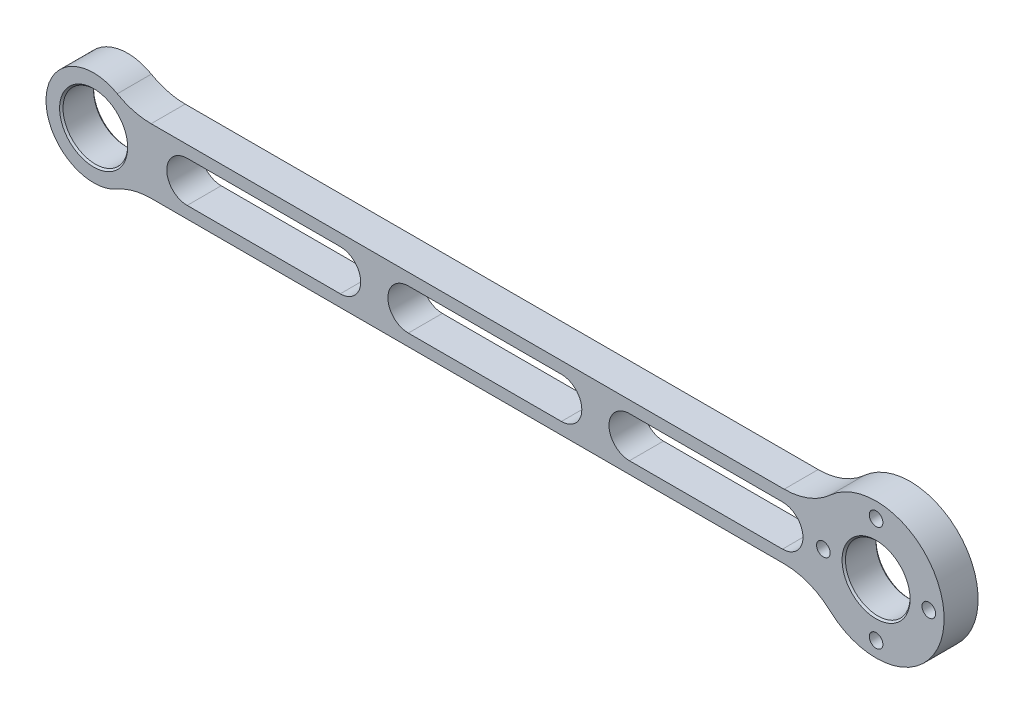
ISO-10303-21;
HEADER;
FILE_DESCRIPTION(('STEP AP214'),'2;1');
FILE_NAME('part.step','',(''),(''),'','','');
FILE_SCHEMA(('AUTOMOTIVE_DESIGN { 1 0 10303 214 1 1 1 1 }'));
ENDSEC;
DATA;
#1=APPLICATION_CONTEXT('core data for automotive mechanical design processes');
#2=APPLICATION_PROTOCOL_DEFINITION('international standard','automotive_design',2000,#1);
#3=PRODUCT_CONTEXT('',#1,'mechanical');
#4=PRODUCT('Part','Part','',(#3));
#5=PRODUCT_RELATED_PRODUCT_CATEGORY('part','',(#4));
#6=PRODUCT_DEFINITION_FORMATION('','',#4);
#7=PRODUCT_DEFINITION_CONTEXT('part definition',#1,'design');
#8=PRODUCT_DEFINITION('design','',#6,#7);
#9=PRODUCT_DEFINITION_SHAPE('','',#8);
#10=(LENGTH_UNIT() NAMED_UNIT(*) SI_UNIT(.MILLI.,.METRE.));
#11=(NAMED_UNIT(*) PLANE_ANGLE_UNIT() SI_UNIT($,.RADIAN.));
#12=(NAMED_UNIT(*) SI_UNIT($,.STERADIAN.) SOLID_ANGLE_UNIT());
#13=UNCERTAINTY_MEASURE_WITH_UNIT(LENGTH_MEASURE(1.E-05),#10,'distance_accuracy_value','');
#14=(GEOMETRIC_REPRESENTATION_CONTEXT(3) GLOBAL_UNCERTAINTY_ASSIGNED_CONTEXT((#13)) GLOBAL_UNIT_ASSIGNED_CONTEXT((#10,
#11,#12)) REPRESENTATION_CONTEXT('',''));
#15=CARTESIAN_POINT('',(0.,0.,0.));
#16=DIRECTION('',(0.,0.,1.));
#17=DIRECTION('',(1.,0.,0.));
#18=AXIS2_PLACEMENT_3D('',#15,#16,#17);
#19=CARTESIAN_POINT('',(202.986114681519,-29.5,10.));
#20=DIRECTION('',(0.,0.,-1.));
#21=DIRECTION('',(-1.,0.,0.));
#22=AXIS2_PLACEMENT_3D('',#19,#20,#21);
#23=CYLINDRICAL_SURFACE('',#22,20.);
#24=CARTESIAN_POINT('',(202.986114681519,-29.5,0.));
#25=DIRECTION('',(0.,0.,1.));
#26=DIRECTION('',(1.,0.,0.));
#27=AXIS2_PLACEMENT_3D('',#24,#25,#26);
#28=CIRCLE('',#27,20.);
#29=CARTESIAN_POINT('',(202.986114681519,-9.49999999999998,0.));
#30=VERTEX_POINT('',#29);
#31=CARTESIAN_POINT('',(216.49305734076,-14.7500000000001,0.));
#32=VERTEX_POINT('',#31);
#33=EDGE_CURVE('E276',#30,#32,#28,.F.);
#34=ORIENTED_EDGE('',*,*,#33,.T.);
#35=DIRECTION('',(0.,0.,-1.));
#36=VECTOR('',#35,1.);
#37=CARTESIAN_POINT('',(216.49305734076,-14.7500000000001,10.));
#38=LINE('',#37,#36);
#39=CARTESIAN_POINT('',(216.49305734076,-14.7500000000001,10.));
#40=VERTEX_POINT('',#39);
#41=EDGE_CURVE('E339',#40,#32,#38,.T.);
#42=ORIENTED_EDGE('',*,*,#41,.F.);
#43=CARTESIAN_POINT('',(202.986114681519,-29.5,10.));
#44=DIRECTION('',(0.,0.,1.));
#45=DIRECTION('',(1.,0.,0.));
#46=AXIS2_PLACEMENT_3D('',#43,#44,#45);
#47=CIRCLE('',#46,20.);
#48=CARTESIAN_POINT('',(202.986114681519,-9.49999999999998,10.));
#49=VERTEX_POINT('',#48);
#50=EDGE_CURVE('E283',#49,#40,#47,.F.);
#51=ORIENTED_EDGE('',*,*,#50,.F.);
#52=DIRECTION('',(0.,0.,-1.));
#53=VECTOR('',#52,1.);
#54=CARTESIAN_POINT('',(202.986114681519,-9.49999999999998,10.));
#55=LINE('',#54,#53);
#56=EDGE_CURVE('E303',#49,#30,#55,.T.);
#57=ORIENTED_EDGE('',*,*,#56,.T.);
#58=EDGE_LOOP('',(#34,#42,#51,#57));
#59=FACE_BOUND('',#58,.T.);
#60=ADVANCED_FACE('F40',(#59),#23,.F.);
#61=CARTESIAN_POINT('',(230.,0.,10.));
#62=DIRECTION('',(0.,0.,-1.));
#63=DIRECTION('',(-1.,0.,0.));
#64=AXIS2_PLACEMENT_3D('',#61,#62,#63);
#65=CYLINDRICAL_SURFACE('',#64,20.0000000000002);
#66=CARTESIAN_POINT('',(230.,0.,0.));
#67=DIRECTION('',(0.,0.,1.));
#68=DIRECTION('',(1.,0.,0.));
#69=AXIS2_PLACEMENT_3D('',#66,#67,#68);
#70=CIRCLE('',#69,20.0000000000002);
#71=CARTESIAN_POINT('',(216.49305734076,14.7500000000001,0.));
#72=VERTEX_POINT('',#71);
#73=EDGE_CURVE('E306',#32,#72,#70,.T.);
#74=ORIENTED_EDGE('',*,*,#73,.T.);
#75=DIRECTION('',(0.,0.,-1.));
#76=VECTOR('',#75,1.);
#77=CARTESIAN_POINT('',(216.49305734076,14.7500000000001,10.));
#78=LINE('',#77,#76);
#79=CARTESIAN_POINT('',(216.49305734076,14.7500000000001,10.));
#80=VERTEX_POINT('',#79);
#81=EDGE_CURVE('E336',#80,#72,#78,.T.);
#82=ORIENTED_EDGE('',*,*,#81,.F.);
#83=CARTESIAN_POINT('',(230.,0.,10.));
#84=DIRECTION('',(0.,0.,1.));
#85=DIRECTION('',(1.,0.,0.));
#86=AXIS2_PLACEMENT_3D('',#83,#84,#85);
#87=CIRCLE('',#86,20.0000000000002);
#88=EDGE_CURVE('E286',#40,#80,#87,.T.);
#89=ORIENTED_EDGE('',*,*,#88,.F.);
#90=ORIENTED_EDGE('',*,*,#41,.T.);
#91=EDGE_LOOP('',(#74,#82,#89,#90));
#92=FACE_BOUND('',#91,.T.);
#93=ADVANCED_FACE('F379',(#92),#65,.T.);
#94=CARTESIAN_POINT('',(202.98611468152,29.5,10.));
#95=DIRECTION('',(0.,0.,-1.));
#96=DIRECTION('',(-1.,0.,0.));
#97=AXIS2_PLACEMENT_3D('',#94,#95,#96);
#98=CYLINDRICAL_SURFACE('',#97,20.);
#99=CARTESIAN_POINT('',(202.98611468152,29.5,0.));
#100=DIRECTION('',(0.,0.,1.));
#101=DIRECTION('',(1.,0.,0.));
#102=AXIS2_PLACEMENT_3D('',#99,#100,#101);
#103=CIRCLE('',#102,20.);
#104=CARTESIAN_POINT('',(202.98611468152,9.50000000000002,0.));
#105=VERTEX_POINT('',#104);
#106=EDGE_CURVE('E308',#72,#105,#103,.F.);
#107=ORIENTED_EDGE('',*,*,#106,.T.);
#108=DIRECTION('',(0.,0.,-1.));
#109=VECTOR('',#108,1.);
#110=CARTESIAN_POINT('',(202.98611468152,9.50000000000002,10.));
#111=LINE('',#110,#109);
#112=CARTESIAN_POINT('',(202.98611468152,9.50000000000002,10.));
#113=VERTEX_POINT('',#112);
#114=EDGE_CURVE('E333',#113,#105,#111,.T.);
#115=ORIENTED_EDGE('',*,*,#114,.F.);
#116=CARTESIAN_POINT('',(202.98611468152,29.5,10.));
#117=DIRECTION('',(0.,0.,1.));
#118=DIRECTION('',(1.,0.,0.));
#119=AXIS2_PLACEMENT_3D('',#116,#117,#118);
#120=CIRCLE('',#119,20.);
#121=EDGE_CURVE('E289',#80,#113,#120,.F.);
#122=ORIENTED_EDGE('',*,*,#121,.F.);
#123=ORIENTED_EDGE('',*,*,#81,.T.);
#124=EDGE_LOOP('',(#107,#115,#122,#123));
#125=FACE_BOUND('',#124,.T.);
#126=ADVANCED_FACE('F385',(#125),#98,.F.);
#127=CARTESIAN_POINT('',(0.,9.49999999999999,10.));
#128=DIRECTION('',(0.,-1.,0.));
#129=DIRECTION('',(1.,0.,0.));
#130=AXIS2_PLACEMENT_3D('',#127,#128,#129);
#131=PLANE('',#130);
#132=DIRECTION('',(-1.,0.,0.));
#133=VECTOR('',#132,1.);
#134=CARTESIAN_POINT('',(0.,9.49999999999999,0.));
#135=LINE('',#134,#133);
#136=CARTESIAN_POINT('',(16.904141504377,9.49999999999999,0.));
#137=VERTEX_POINT('',#136);
#138=EDGE_CURVE('E310',#105,#137,#135,.T.);
#139=ORIENTED_EDGE('',*,*,#138,.T.);
#140=DIRECTION('',(0.,0.,-1.));
#141=VECTOR('',#140,1.);
#142=CARTESIAN_POINT('',(16.904141504377,9.49999999999999,10.));
#143=LINE('',#142,#141);
#144=CARTESIAN_POINT('',(16.904141504377,9.49999999999999,10.));
#145=VERTEX_POINT('',#144);
#146=EDGE_CURVE('E331',#145,#137,#143,.T.);
#147=ORIENTED_EDGE('',*,*,#146,.F.);
#148=DIRECTION('',(-1.,0.,0.));
#149=VECTOR('',#148,1.);
#150=CARTESIAN_POINT('',(0.,9.49999999999999,10.));
#151=LINE('',#150,#149);
#152=EDGE_CURVE('E291',#113,#145,#151,.T.);
#153=ORIENTED_EDGE('',*,*,#152,.F.);
#154=ORIENTED_EDGE('',*,*,#114,.T.);
#155=EDGE_LOOP('',(#139,#147,#153,#154));
#156=FACE_BOUND('',#155,.T.);
#157=ADVANCED_FACE('F438',(#156),#131,.F.);
#158=CARTESIAN_POINT('',(16.904141504377,29.5,10.));
#159=DIRECTION('',(0.,0.,-1.));
#160=DIRECTION('',(-1.,0.,0.));
#161=AXIS2_PLACEMENT_3D('',#158,#159,#160);
#162=CYLINDRICAL_SURFACE('',#161,20.);
#163=CARTESIAN_POINT('',(16.904141504377,29.5,0.));
#164=DIRECTION('',(0.,0.,1.));
#165=DIRECTION('',(1.,0.,0.));
#166=AXIS2_PLACEMENT_3D('',#163,#164,#165);
#167=CIRCLE('',#166,20.);
#168=CARTESIAN_POINT('',(6.96052885474347,12.1470588235294,0.));
#169=VERTEX_POINT('',#168);
#170=EDGE_CURVE('E313',#169,#137,#167,.T.);
#171=ORIENTED_EDGE('',*,*,#170,.F.);
#172=DIRECTION('',(0.,0.,-1.));
#173=VECTOR('',#172,1.);
#174=CARTESIAN_POINT('',(6.96052885474347,12.1470588235294,10.));
#175=LINE('',#174,#173);
#176=CARTESIAN_POINT('',(6.96052885474347,12.1470588235294,10.));
#177=VERTEX_POINT('',#176);
#178=EDGE_CURVE('E329',#177,#169,#175,.T.);
#179=ORIENTED_EDGE('',*,*,#178,.F.);
#180=CARTESIAN_POINT('',(16.904141504377,29.5,10.));
#181=DIRECTION('',(0.,0.,1.));
#182=DIRECTION('',(1.,0.,0.));
#183=AXIS2_PLACEMENT_3D('',#180,#181,#182);
#184=CIRCLE('',#183,20.);
#185=EDGE_CURVE('E293',#177,#145,#184,.T.);
#186=ORIENTED_EDGE('',*,*,#185,.T.);
#187=ORIENTED_EDGE('',*,*,#146,.T.);
#188=EDGE_LOOP('',(#171,#179,#186,#187));
#189=FACE_BOUND('',#188,.T.);
#190=ADVANCED_FACE('F432',(#189),#162,.F.);
#191=CARTESIAN_POINT('',(0.,0.,10.));
#192=DIRECTION('',(0.,0.,-1.));
#193=DIRECTION('',(-1.,0.,0.));
#194=AXIS2_PLACEMENT_3D('',#191,#192,#193);
#195=CYLINDRICAL_SURFACE('',#194,14.);
#196=CARTESIAN_POINT('',(0.,0.,0.));
#197=DIRECTION('',(0.,0.,1.));
#198=DIRECTION('',(1.,0.,0.));
#199=AXIS2_PLACEMENT_3D('',#196,#197,#198);
#200=CIRCLE('',#199,14.);
#201=CARTESIAN_POINT('',(6.96052885474345,-12.1470588235294,0.));
#202=VERTEX_POINT('',#201);
#203=EDGE_CURVE('E316',#169,#202,#200,.T.);
#204=ORIENTED_EDGE('',*,*,#203,.T.);
#205=DIRECTION('',(0.,0.,-1.));
#206=VECTOR('',#205,1.);
#207=CARTESIAN_POINT('',(6.96052885474345,-12.1470588235294,10.));
#208=LINE('',#207,#206);
#209=CARTESIAN_POINT('',(6.96052885474345,-12.1470588235294,10.));
#210=VERTEX_POINT('',#209);
#211=EDGE_CURVE('E326',#210,#202,#208,.T.);
#212=ORIENTED_EDGE('',*,*,#211,.F.);
#213=CARTESIAN_POINT('',(0.,0.,10.));
#214=DIRECTION('',(0.,0.,1.));
#215=DIRECTION('',(1.,0.,0.));
#216=AXIS2_PLACEMENT_3D('',#213,#214,#215);
#217=CIRCLE('',#216,14.);
#218=EDGE_CURVE('E296',#177,#210,#217,.T.);
#219=ORIENTED_EDGE('',*,*,#218,.F.);
#220=ORIENTED_EDGE('',*,*,#178,.T.);
#221=EDGE_LOOP('',(#204,#212,#219,#220));
#222=FACE_BOUND('',#221,.T.);
#223=ADVANCED_FACE('F444',(#222),#195,.T.);
#224=CARTESIAN_POINT('',(16.904141504377,-29.5,10.));
#225=DIRECTION('',(0.,0.,-1.));
#226=DIRECTION('',(-1.,0.,0.));
#227=AXIS2_PLACEMENT_3D('',#224,#225,#226);
#228=CYLINDRICAL_SURFACE('',#227,20.);
#229=CARTESIAN_POINT('',(16.904141504377,-29.5,0.));
#230=DIRECTION('',(0.,0.,1.));
#231=DIRECTION('',(1.,0.,0.));
#232=AXIS2_PLACEMENT_3D('',#229,#230,#231);
#233=CIRCLE('',#232,20.);
#234=CARTESIAN_POINT('',(16.904141504377,-9.50000000000001,0.));
#235=VERTEX_POINT('',#234);
#236=EDGE_CURVE('E318',#202,#235,#233,.F.);
#237=ORIENTED_EDGE('',*,*,#236,.T.);
#238=DIRECTION('',(0.,0.,-1.));
#239=VECTOR('',#238,1.);
#240=CARTESIAN_POINT('',(16.904141504377,-9.50000000000001,10.));
#241=LINE('',#240,#239);
#242=CARTESIAN_POINT('',(16.904141504377,-9.50000000000001,10.));
#243=VERTEX_POINT('',#242);
#244=EDGE_CURVE('E324',#243,#235,#241,.T.);
#245=ORIENTED_EDGE('',*,*,#244,.F.);
#246=CARTESIAN_POINT('',(16.904141504377,-29.5,10.));
#247=DIRECTION('',(0.,0.,1.));
#248=DIRECTION('',(1.,0.,0.));
#249=AXIS2_PLACEMENT_3D('',#246,#247,#248);
#250=CIRCLE('',#249,20.);
#251=EDGE_CURVE('E298',#210,#243,#250,.F.);
#252=ORIENTED_EDGE('',*,*,#251,.F.);
#253=ORIENTED_EDGE('',*,*,#211,.T.);
#254=EDGE_LOOP('',(#237,#245,#252,#253));
#255=FACE_BOUND('',#254,.T.);
#256=ADVANCED_FACE('F425',(#255),#228,.F.);
#257=CARTESIAN_POINT('',(0.,0.,10.));
#258=DIRECTION('',(0.,0.,-1.));
#259=DIRECTION('',(-1.,0.,0.));
#260=AXIS2_PLACEMENT_3D('',#257,#258,#259);
#261=CYLINDRICAL_SURFACE('',#260,9.5);
#262=CARTESIAN_POINT('',(0.,0.,9.50000000000004));
#263=DIRECTION('',(0.,0.,1.));
#264=DIRECTION('',(1.,0.,0.));
#265=AXIS2_PLACEMENT_3D('',#262,#263,#264);
#266=CIRCLE('',#265,9.5);
#267=CARTESIAN_POINT('',(9.5,0.,9.50000000000004));
#268=VERTEX_POINT('',#267);
#269=EDGE_CURVE('E345',#268,#268,#266,.T.);
#270=ORIENTED_EDGE('',*,*,#269,.T.);
#271=EDGE_LOOP('',(#270));
#272=FACE_BOUND('',#271,.T.);
#273=CARTESIAN_POINT('',(0.,0.,0.499999999999974));
#274=DIRECTION('',(0.,0.,1.));
#275=DIRECTION('',(1.,0.,0.));
#276=AXIS2_PLACEMENT_3D('',#273,#274,#275);
#277=CIRCLE('',#276,9.5);
#278=CARTESIAN_POINT('',(9.5,0.,0.499999999999974));
#279=VERTEX_POINT('',#278);
#280=EDGE_CURVE('E342',#279,#279,#277,.F.);
#281=ORIENTED_EDGE('',*,*,#280,.T.);
#282=EDGE_LOOP('',(#281));
#283=FACE_BOUND('',#282,.T.);
#284=ADVANCED_FACE('F451',(#272,#283),#261,.F.);
#285=CARTESIAN_POINT('',(0.,-9.50000000000001,10.));
#286=DIRECTION('',(0.,-1.,0.));
#287=DIRECTION('',(0.,0.,-1.));
#288=AXIS2_PLACEMENT_3D('',#285,#286,#287);
#289=PLANE('',#288);
#290=DIRECTION('',(-1.,0.,0.));
#291=VECTOR('',#290,1.);
#292=CARTESIAN_POINT('',(0.,-9.50000000000001,0.));
#293=LINE('',#292,#291);
#294=EDGE_CURVE('E287',#30,#235,#293,.T.);
#295=ORIENTED_EDGE('',*,*,#294,.F.);
#296=ORIENTED_EDGE('',*,*,#56,.F.);
#297=DIRECTION('',(-1.,0.,0.));
#298=VECTOR('',#297,1.);
#299=CARTESIAN_POINT('',(0.,-9.50000000000001,10.));
#300=LINE('',#299,#298);
#301=EDGE_CURVE('E300',#49,#243,#300,.T.);
#302=ORIENTED_EDGE('',*,*,#301,.T.);
#303=ORIENTED_EDGE('',*,*,#244,.T.);
#304=EDGE_LOOP('',(#295,#296,#302,#303));
#305=FACE_BOUND('',#304,.T.);
#306=ADVANCED_FACE('F419',(#305),#289,.T.);
#307=CARTESIAN_POINT('',(230.,0.,10.));
#308=DIRECTION('',(0.,0.,-1.));
#309=DIRECTION('',(-1.,0.,0.));
#310=AXIS2_PLACEMENT_3D('',#307,#308,#309);
#311=CYLINDRICAL_SURFACE('',#310,9.50000000000001);
#312=CARTESIAN_POINT('',(230.,0.,0.500000000000006));
#313=DIRECTION('',(0.,0.,1.));
#314=DIRECTION('',(1.,0.,0.));
#315=AXIS2_PLACEMENT_3D('',#312,#313,#314);
#316=CIRCLE('',#315,9.50000000000001);
#317=CARTESIAN_POINT('',(239.5,0.,0.500000000000006));
#318=VERTEX_POINT('',#317);
#319=EDGE_CURVE('E11',#318,#318,#316,.F.);
#320=ORIENTED_EDGE('',*,*,#319,.T.);
#321=EDGE_LOOP('',(#320));
#322=FACE_BOUND('',#321,.T.);
#323=CARTESIAN_POINT('',(230.,0.,9.50000000000005));
#324=DIRECTION('',(0.,0.,1.));
#325=DIRECTION('',(1.,0.,0.));
#326=AXIS2_PLACEMENT_3D('',#323,#324,#325);
#327=CIRCLE('',#326,9.50000000000001);
#328=CARTESIAN_POINT('',(239.5,0.,9.50000000000005));
#329=VERTEX_POINT('',#328);
#330=EDGE_CURVE('E354',#329,#329,#327,.T.);
#331=ORIENTED_EDGE('',*,*,#330,.T.);
#332=EDGE_LOOP('',(#331));
#333=FACE_BOUND('',#332,.T.);
#334=ADVANCED_FACE('F492',(#322,#333),#311,.F.);
#335=CARTESIAN_POINT('',(0.,0.,10.));
#336=DIRECTION('',(0.,0.,1.));
#337=DIRECTION('',(1.,0.,0.));
#338=AXIS2_PLACEMENT_3D('',#335,#336,#337);
#339=PLANE('',#338);
#340=CARTESIAN_POINT('',(230.,15.5,10.));
#341=DIRECTION('',(0.,0.,1.));
#342=DIRECTION('',(0.,-1.,0.));
#343=AXIS2_PLACEMENT_3D('',#340,#341,#342);
#344=CIRCLE('',#343,2.);
#345=CARTESIAN_POINT('',(230.,13.5,10.));
#346=VERTEX_POINT('',#345);
#347=EDGE_CURVE('E703',#346,#346,#344,.T.);
#348=ORIENTED_EDGE('',*,*,#347,.F.);
#349=EDGE_LOOP('',(#348));
#350=FACE_BOUND('',#349,.T.);
#351=CARTESIAN_POINT('',(245.5,1.08235921504137E-13,10.));
#352=DIRECTION('',(0.,0.,1.));
#353=DIRECTION('',(-1.,0.,0.));
#354=AXIS2_PLACEMENT_3D('',#351,#352,#353);
#355=CIRCLE('',#354,2.);
#356=CARTESIAN_POINT('',(243.5,1.08235921504137E-13,10.));
#357=VERTEX_POINT('',#356);
#358=EDGE_CURVE('E708',#357,#357,#355,.T.);
#359=ORIENTED_EDGE('',*,*,#358,.F.);
#360=EDGE_LOOP('',(#359));
#361=FACE_BOUND('',#360,.T.);
#362=CARTESIAN_POINT('',(230.,-15.5,10.));
#363=DIRECTION('',(0.,0.,1.));
#364=DIRECTION('',(0.,1.,0.));
#365=AXIS2_PLACEMENT_3D('',#362,#363,#364);
#366=CIRCLE('',#365,2.);
#367=CARTESIAN_POINT('',(230.,-13.5,10.));
#368=VERTEX_POINT('',#367);
#369=EDGE_CURVE('E716',#368,#368,#366,.T.);
#370=ORIENTED_EDGE('',*,*,#369,.F.);
#371=EDGE_LOOP('',(#370));
#372=FACE_BOUND('',#371,.T.);
#373=CARTESIAN_POINT('',(214.5,-1.08235921504137E-13,10.));
#374=DIRECTION('',(0.,0.,1.));
#375=DIRECTION('',(1.,0.,0.));
#376=AXIS2_PLACEMENT_3D('',#373,#374,#375);
#377=CIRCLE('',#376,2.);
#378=CARTESIAN_POINT('',(216.5,-1.08235921504137E-13,10.));
#379=VERTEX_POINT('',#378);
#380=EDGE_CURVE('E204',#379,#379,#377,.T.);
#381=ORIENTED_EDGE('',*,*,#380,.F.);
#382=EDGE_LOOP('',(#381));
#383=FACE_BOUND('',#382,.T.);
#384=CARTESIAN_POINT('',(230.,0.,10.));
#385=DIRECTION('',(0.,0.,1.));
#386=DIRECTION('',(1.,0.,0.));
#387=AXIS2_PLACEMENT_3D('',#384,#385,#386);
#388=CIRCLE('',#387,9.99999999999998);
#389=CARTESIAN_POINT('',(240.,0.,10.));
#390=VERTEX_POINT('',#389);
#391=EDGE_CURVE('E357',#390,#390,#388,.F.);
#392=ORIENTED_EDGE('',*,*,#391,.T.);
#393=EDGE_LOOP('',(#392));
#394=FACE_BOUND('',#393,.T.);
#395=CARTESIAN_POINT('',(72.5,0.,10.));
#396=DIRECTION('',(0.,0.,1.));
#397=DIRECTION('',(1.,0.,0.));
#398=AXIS2_PLACEMENT_3D('',#395,#396,#397);
#399=CIRCLE('',#398,6.);
#400=CARTESIAN_POINT('',(72.5,-6.,10.));
#401=VERTEX_POINT('',#400);
#402=CARTESIAN_POINT('',(72.5,6.,10.));
#403=VERTEX_POINT('',#402);
#404=EDGE_CURVE('E55',#401,#403,#399,.T.);
#405=ORIENTED_EDGE('',*,*,#404,.F.);
#406=DIRECTION('',(1.,0.,0.));
#407=VECTOR('',#406,1.);
#408=CARTESIAN_POINT('',(27.5,-6.,10.));
#409=LINE('',#408,#407);
#410=CARTESIAN_POINT('',(27.5,-6.,10.));
#411=VERTEX_POINT('',#410);
#412=EDGE_CURVE('E225',#411,#401,#409,.T.);
#413=ORIENTED_EDGE('',*,*,#412,.F.);
#414=CARTESIAN_POINT('',(27.5,0.,10.));
#415=DIRECTION('',(0.,0.,1.));
#416=DIRECTION('',(1.,0.,0.));
#417=AXIS2_PLACEMENT_3D('',#414,#415,#416);
#418=CIRCLE('',#417,6.);
#419=CARTESIAN_POINT('',(27.5,6.,10.));
#420=VERTEX_POINT('',#419);
#421=EDGE_CURVE('E240',#420,#411,#418,.T.);
#422=ORIENTED_EDGE('',*,*,#421,.F.);
#423=DIRECTION('',(-1.,0.,0.));
#424=VECTOR('',#423,1.);
#425=CARTESIAN_POINT('',(27.5,6.,10.));
#426=LINE('',#425,#424);
#427=EDGE_CURVE('E236',#403,#420,#426,.T.);
#428=ORIENTED_EDGE('',*,*,#427,.F.);
#429=EDGE_LOOP('',(#405,#413,#422,#428));
#430=FACE_BOUND('',#429,.T.);
#431=CARTESIAN_POINT('',(202.5,0.,10.));
#432=DIRECTION('',(0.,0.,1.));
#433=DIRECTION('',(1.,0.,0.));
#434=AXIS2_PLACEMENT_3D('',#431,#432,#433);
#435=CIRCLE('',#434,6.);
#436=CARTESIAN_POINT('',(202.5,-6.,10.));
#437=VERTEX_POINT('',#436);
#438=CARTESIAN_POINT('',(202.5,6.,10.));
#439=VERTEX_POINT('',#438);
#440=EDGE_CURVE('E63',#437,#439,#435,.T.);
#441=ORIENTED_EDGE('',*,*,#440,.F.);
#442=DIRECTION('',(1.,0.,0.));
#443=VECTOR('',#442,1.);
#444=CARTESIAN_POINT('',(157.5,-6.,10.));
#445=LINE('',#444,#443);
#446=CARTESIAN_POINT('',(157.5,-5.99999999999999,10.));
#447=VERTEX_POINT('',#446);
#448=EDGE_CURVE('E198',#447,#437,#445,.T.);
#449=ORIENTED_EDGE('',*,*,#448,.F.);
#450=CARTESIAN_POINT('',(157.5,0.,10.));
#451=DIRECTION('',(0.,0.,1.));
#452=DIRECTION('',(1.,0.,0.));
#453=AXIS2_PLACEMENT_3D('',#450,#451,#452);
#454=CIRCLE('',#453,6.);
#455=CARTESIAN_POINT('',(157.5,6.,10.));
#456=VERTEX_POINT('',#455);
#457=EDGE_CURVE('E201',#456,#447,#454,.T.);
#458=ORIENTED_EDGE('',*,*,#457,.F.);
#459=DIRECTION('',(-1.,0.,0.));
#460=VECTOR('',#459,1.);
#461=CARTESIAN_POINT('',(157.5,6.,10.));
#462=LINE('',#461,#460);
#463=EDGE_CURVE('E210',#439,#456,#462,.T.);
#464=ORIENTED_EDGE('',*,*,#463,.F.);
#465=EDGE_LOOP('',(#441,#449,#458,#464));
#466=FACE_BOUND('',#465,.T.);
#467=CARTESIAN_POINT('',(137.5,0.,10.));
#468=DIRECTION('',(0.,0.,1.));
#469=DIRECTION('',(1.,0.,0.));
#470=AXIS2_PLACEMENT_3D('',#467,#468,#469);
#471=CIRCLE('',#470,6.);
#472=CARTESIAN_POINT('',(137.5,-6.,10.));
#473=VERTEX_POINT('',#472);
#474=CARTESIAN_POINT('',(137.5,6.,10.));
#475=VERTEX_POINT('',#474);
#476=EDGE_CURVE('E217',#473,#475,#471,.T.);
#477=ORIENTED_EDGE('',*,*,#476,.F.);
#478=DIRECTION('',(1.,0.,0.));
#479=VECTOR('',#478,1.);
#480=CARTESIAN_POINT('',(92.5,-6.,10.));
#481=LINE('',#480,#479);
#482=CARTESIAN_POINT('',(92.5,-6.,10.));
#483=VERTEX_POINT('',#482);
#484=EDGE_CURVE('E255',#483,#473,#481,.T.);
#485=ORIENTED_EDGE('',*,*,#484,.F.);
#486=CARTESIAN_POINT('',(92.5,0.,10.));
#487=DIRECTION('',(0.,0.,1.));
#488=DIRECTION('',(1.,0.,0.));
#489=AXIS2_PLACEMENT_3D('',#486,#487,#488);
#490=CIRCLE('',#489,6.);
#491=CARTESIAN_POINT('',(92.5,6.,10.));
#492=VERTEX_POINT('',#491);
#493=EDGE_CURVE('E269',#492,#483,#490,.T.);
#494=ORIENTED_EDGE('',*,*,#493,.F.);
#495=DIRECTION('',(-1.,0.,0.));
#496=VECTOR('',#495,1.);
#497=CARTESIAN_POINT('',(92.5,6.,10.));
#498=LINE('',#497,#496);
#499=EDGE_CURVE('E266',#475,#492,#498,.T.);
#500=ORIENTED_EDGE('',*,*,#499,.F.);
#501=EDGE_LOOP('',(#477,#485,#494,#500));
#502=FACE_BOUND('',#501,.T.);
#503=CARTESIAN_POINT('',(0.,0.,10.));
#504=DIRECTION('',(0.,0.,1.));
#505=DIRECTION('',(1.,0.,0.));
#506=AXIS2_PLACEMENT_3D('',#503,#504,#505);
#507=CIRCLE('',#506,9.99999999999998);
#508=CARTESIAN_POINT('',(9.99999999999998,0.,10.));
#509=VERTEX_POINT('',#508);
#510=EDGE_CURVE('E348',#509,#509,#507,.F.);
#511=ORIENTED_EDGE('',*,*,#510,.T.);
#512=EDGE_LOOP('',(#511));
#513=FACE_BOUND('',#512,.T.);
#514=ORIENTED_EDGE('',*,*,#50,.T.);
#515=ORIENTED_EDGE('',*,*,#88,.T.);
#516=ORIENTED_EDGE('',*,*,#121,.T.);
#517=ORIENTED_EDGE('',*,*,#152,.T.);
#518=ORIENTED_EDGE('',*,*,#185,.F.);
#519=ORIENTED_EDGE('',*,*,#218,.T.);
#520=ORIENTED_EDGE('',*,*,#251,.T.);
#521=ORIENTED_EDGE('',*,*,#301,.F.);
#522=EDGE_LOOP('',(#514,#515,#516,#517,#518,#519,#520,#521));
#523=FACE_BOUND('',#522,.T.);
#524=ADVANCED_FACE('F410',(#350,#361,#372,#383,#394,#430,#466,#502,#513,#523),#339,.T.);
#525=CARTESIAN_POINT('',(0.,0.,0.));
#526=DIRECTION('',(0.,0.,1.));
#527=DIRECTION('',(1.,0.,0.));
#528=AXIS2_PLACEMENT_3D('',#525,#526,#527);
#529=PLANE('',#528);
#530=CARTESIAN_POINT('',(230.,15.5,0.));
#531=DIRECTION('',(0.,0.,1.));
#532=DIRECTION('',(0.,-1.,0.));
#533=AXIS2_PLACEMENT_3D('',#530,#531,#532);
#534=CIRCLE('',#533,2.);
#535=CARTESIAN_POINT('',(230.,13.5,0.));
#536=VERTEX_POINT('',#535);
#537=EDGE_CURVE('E700',#536,#536,#534,.T.);
#538=ORIENTED_EDGE('',*,*,#537,.T.);
#539=EDGE_LOOP('',(#538));
#540=FACE_BOUND('',#539,.T.);
#541=CARTESIAN_POINT('',(245.5,1.08235921504137E-13,0.));
#542=DIRECTION('',(0.,0.,1.));
#543=DIRECTION('',(-1.,0.,0.));
#544=AXIS2_PLACEMENT_3D('',#541,#542,#543);
#545=CIRCLE('',#544,2.);
#546=CARTESIAN_POINT('',(243.5,1.08235921504137E-13,0.));
#547=VERTEX_POINT('',#546);
#548=EDGE_CURVE('E704',#547,#547,#545,.T.);
#549=ORIENTED_EDGE('',*,*,#548,.T.);
#550=EDGE_LOOP('',(#549));
#551=FACE_BOUND('',#550,.T.);
#552=CARTESIAN_POINT('',(230.,-15.5,0.));
#553=DIRECTION('',(0.,0.,1.));
#554=DIRECTION('',(0.,1.,0.));
#555=AXIS2_PLACEMENT_3D('',#552,#553,#554);
#556=CIRCLE('',#555,2.);
#557=CARTESIAN_POINT('',(230.,-13.5,0.));
#558=VERTEX_POINT('',#557);
#559=EDGE_CURVE('E713',#558,#558,#556,.T.);
#560=ORIENTED_EDGE('',*,*,#559,.T.);
#561=EDGE_LOOP('',(#560));
#562=FACE_BOUND('',#561,.T.);
#563=CARTESIAN_POINT('',(214.5,-1.08235921504137E-13,0.));
#564=DIRECTION('',(0.,0.,1.));
#565=DIRECTION('',(1.,0.,0.));
#566=AXIS2_PLACEMENT_3D('',#563,#564,#565);
#567=CIRCLE('',#566,2.);
#568=CARTESIAN_POINT('',(216.5,-1.08235921504137E-13,0.));
#569=VERTEX_POINT('',#568);
#570=EDGE_CURVE('E237',#569,#569,#567,.T.);
#571=ORIENTED_EDGE('',*,*,#570,.T.);
#572=EDGE_LOOP('',(#571));
#573=FACE_BOUND('',#572,.T.);
#574=CARTESIAN_POINT('',(230.,0.,0.));
#575=DIRECTION('',(0.,0.,1.));
#576=DIRECTION('',(1.,0.,0.));
#577=AXIS2_PLACEMENT_3D('',#574,#575,#576);
#578=CIRCLE('',#577,10.);
#579=CARTESIAN_POINT('',(240.,0.,0.));
#580=VERTEX_POINT('',#579);
#581=EDGE_CURVE('E48',#580,#580,#578,.T.);
#582=ORIENTED_EDGE('',*,*,#581,.T.);
#583=EDGE_LOOP('',(#582));
#584=FACE_BOUND('',#583,.T.);
#585=DIRECTION('',(1.,0.,0.));
#586=VECTOR('',#585,1.);
#587=CARTESIAN_POINT('',(27.5,-6.,0.));
#588=LINE('',#587,#586);
#589=CARTESIAN_POINT('',(27.5,-6.,0.));
#590=VERTEX_POINT('',#589);
#591=CARTESIAN_POINT('',(72.5,-6.,0.));
#592=VERTEX_POINT('',#591);
#593=EDGE_CURVE('E231',#590,#592,#588,.T.);
#594=ORIENTED_EDGE('',*,*,#593,.T.);
#595=CARTESIAN_POINT('',(72.5,0.,0.));
#596=DIRECTION('',(0.,0.,1.));
#597=DIRECTION('',(1.,0.,0.));
#598=AXIS2_PLACEMENT_3D('',#595,#596,#597);
#599=CIRCLE('',#598,6.);
#600=CARTESIAN_POINT('',(72.5,6.,0.));
#601=VERTEX_POINT('',#600);
#602=EDGE_CURVE('E221',#592,#601,#599,.T.);
#603=ORIENTED_EDGE('',*,*,#602,.T.);
#604=DIRECTION('',(-1.,0.,0.));
#605=VECTOR('',#604,1.);
#606=CARTESIAN_POINT('',(27.5,6.,0.));
#607=LINE('',#606,#605);
#608=CARTESIAN_POINT('',(27.5,6.,0.));
#609=VERTEX_POINT('',#608);
#610=EDGE_CURVE('E224',#601,#609,#607,.T.);
#611=ORIENTED_EDGE('',*,*,#610,.T.);
#612=CARTESIAN_POINT('',(27.5,0.,0.));
#613=DIRECTION('',(0.,0.,1.));
#614=DIRECTION('',(1.,0.,0.));
#615=AXIS2_PLACEMENT_3D('',#612,#613,#614);
#616=CIRCLE('',#615,6.);
#617=EDGE_CURVE('E228',#609,#590,#616,.T.);
#618=ORIENTED_EDGE('',*,*,#617,.T.);
#619=EDGE_LOOP('',(#594,#603,#611,#618));
#620=FACE_BOUND('',#619,.T.);
#621=DIRECTION('',(1.,0.,0.));
#622=VECTOR('',#621,1.);
#623=CARTESIAN_POINT('',(157.5,-6.,0.));
#624=LINE('',#623,#622);
#625=CARTESIAN_POINT('',(157.5,-5.99999999999999,0.));
#626=VERTEX_POINT('',#625);
#627=CARTESIAN_POINT('',(202.5,-6.,0.));
#628=VERTEX_POINT('',#627);
#629=EDGE_CURVE('E185',#626,#628,#624,.T.);
#630=ORIENTED_EDGE('',*,*,#629,.T.);
#631=CARTESIAN_POINT('',(202.5,0.,0.));
#632=DIRECTION('',(0.,0.,1.));
#633=DIRECTION('',(1.,0.,0.));
#634=AXIS2_PLACEMENT_3D('',#631,#632,#633);
#635=CIRCLE('',#634,6.);
#636=CARTESIAN_POINT('',(202.5,6.,0.));
#637=VERTEX_POINT('',#636);
#638=EDGE_CURVE('E179',#628,#637,#635,.T.);
#639=ORIENTED_EDGE('',*,*,#638,.T.);
#640=DIRECTION('',(-1.,0.,0.));
#641=VECTOR('',#640,1.);
#642=CARTESIAN_POINT('',(157.5,6.,0.));
#643=LINE('',#642,#641);
#644=CARTESIAN_POINT('',(157.5,6.,0.));
#645=VERTEX_POINT('',#644);
#646=EDGE_CURVE('E189',#637,#645,#643,.T.);
#647=ORIENTED_EDGE('',*,*,#646,.T.);
#648=CARTESIAN_POINT('',(157.5,0.,0.));
#649=DIRECTION('',(0.,0.,1.));
#650=DIRECTION('',(1.,0.,0.));
#651=AXIS2_PLACEMENT_3D('',#648,#649,#650);
#652=CIRCLE('',#651,6.);
#653=EDGE_CURVE('E193',#645,#626,#652,.T.);
#654=ORIENTED_EDGE('',*,*,#653,.T.);
#655=EDGE_LOOP('',(#630,#639,#647,#654));
#656=FACE_BOUND('',#655,.T.);
#657=DIRECTION('',(1.,0.,0.));
#658=VECTOR('',#657,1.);
#659=CARTESIAN_POINT('',(92.5,-6.,0.));
#660=LINE('',#659,#658);
#661=CARTESIAN_POINT('',(92.5,-6.,0.));
#662=VERTEX_POINT('',#661);
#663=CARTESIAN_POINT('',(137.5,-6.,0.));
#664=VERTEX_POINT('',#663);
#665=EDGE_CURVE('E261',#662,#664,#660,.T.);
#666=ORIENTED_EDGE('',*,*,#665,.T.);
#667=CARTESIAN_POINT('',(137.5,0.,0.));
#668=DIRECTION('',(0.,0.,1.));
#669=DIRECTION('',(1.,0.,0.));
#670=AXIS2_PLACEMENT_3D('',#667,#668,#669);
#671=CIRCLE('',#670,6.);
#672=CARTESIAN_POINT('',(137.5,6.,0.));
#673=VERTEX_POINT('',#672);
#674=EDGE_CURVE('E251',#664,#673,#671,.T.);
#675=ORIENTED_EDGE('',*,*,#674,.T.);
#676=DIRECTION('',(-1.,0.,0.));
#677=VECTOR('',#676,1.);
#678=CARTESIAN_POINT('',(92.5,6.,0.));
#679=LINE('',#678,#677);
#680=CARTESIAN_POINT('',(92.5,6.,0.));
#681=VERTEX_POINT('',#680);
#682=EDGE_CURVE('E254',#673,#681,#679,.T.);
#683=ORIENTED_EDGE('',*,*,#682,.T.);
#684=CARTESIAN_POINT('',(92.5,0.,0.));
#685=DIRECTION('',(0.,0.,1.));
#686=DIRECTION('',(1.,0.,0.));
#687=AXIS2_PLACEMENT_3D('',#684,#685,#686);
#688=CIRCLE('',#687,6.);
#689=EDGE_CURVE('E258',#681,#662,#688,.T.);
#690=ORIENTED_EDGE('',*,*,#689,.T.);
#691=EDGE_LOOP('',(#666,#675,#683,#690));
#692=FACE_BOUND('',#691,.T.);
#693=CARTESIAN_POINT('',(0.,0.,0.));
#694=DIRECTION('',(0.,0.,1.));
#695=DIRECTION('',(1.,0.,0.));
#696=AXIS2_PLACEMENT_3D('',#693,#694,#695);
#697=CIRCLE('',#696,9.99999999999998);
#698=CARTESIAN_POINT('',(9.99999999999998,0.,0.));
#699=VERTEX_POINT('',#698);
#700=EDGE_CURVE('E351',#699,#699,#697,.T.);
#701=ORIENTED_EDGE('',*,*,#700,.T.);
#702=EDGE_LOOP('',(#701));
#703=FACE_BOUND('',#702,.T.);
#704=ORIENTED_EDGE('',*,*,#33,.F.);
#705=ORIENTED_EDGE('',*,*,#294,.T.);
#706=ORIENTED_EDGE('',*,*,#236,.F.);
#707=ORIENTED_EDGE('',*,*,#203,.F.);
#708=ORIENTED_EDGE('',*,*,#170,.T.);
#709=ORIENTED_EDGE('',*,*,#138,.F.);
#710=ORIENTED_EDGE('',*,*,#106,.F.);
#711=ORIENTED_EDGE('',*,*,#73,.F.);
#712=EDGE_LOOP('',(#704,#705,#706,#707,#708,#709,#710,#711));
#713=FACE_BOUND('',#712,.T.);
#714=ADVANCED_FACE('F195',(#540,#551,#562,#573,#584,#620,#656,#692,#703,#713),#529,.F.);
#715=CARTESIAN_POINT('',(0.,0.,9.50000000000004));
#716=DIRECTION('',(0.,0.,1.));
#717=DIRECTION('',(1.,0.,0.));
#718=AXIS2_PLACEMENT_3D('',#715,#716,#717);
#719=CONICAL_SURFACE('',#718,9.5,0.785398163397471);
#720=ORIENTED_EDGE('',*,*,#510,.F.);
#721=EDGE_LOOP('',(#720));
#722=FACE_BOUND('',#721,.T.);
#723=ORIENTED_EDGE('',*,*,#269,.F.);
#724=EDGE_LOOP('',(#723));
#725=FACE_BOUND('',#724,.T.);
#726=ADVANCED_FACE('F390',(#722,#725),#719,.F.);
#727=CARTESIAN_POINT('',(0.,0.,0.));
#728=DIRECTION('',(0.,0.,-1.));
#729=DIRECTION('',(-1.,0.,0.));
#730=AXIS2_PLACEMENT_3D('',#727,#728,#729);
#731=CONICAL_SURFACE('',#730,9.99999999999998,0.785398163397453);
#732=ORIENTED_EDGE('',*,*,#280,.F.);
#733=EDGE_LOOP('',(#732));
#734=FACE_BOUND('',#733,.T.);
#735=ORIENTED_EDGE('',*,*,#700,.F.);
#736=EDGE_LOOP('',(#735));
#737=FACE_BOUND('',#736,.T.);
#738=ADVANCED_FACE('F393',(#734,#737),#731,.F.);
#739=CARTESIAN_POINT('',(137.5,0.,0.));
#740=DIRECTION('',(0.,0.,1.));
#741=DIRECTION('',(1.,0.,0.));
#742=AXIS2_PLACEMENT_3D('',#739,#740,#741);
#743=CYLINDRICAL_SURFACE('',#742,6.);
#744=ORIENTED_EDGE('',*,*,#476,.T.);
#745=DIRECTION('',(0.,0.,1.));
#746=VECTOR('',#745,1.);
#747=CARTESIAN_POINT('',(137.5,6.,0.));
#748=LINE('',#747,#746);
#749=EDGE_CURVE('E264',#673,#475,#748,.T.);
#750=ORIENTED_EDGE('',*,*,#749,.F.);
#751=ORIENTED_EDGE('',*,*,#674,.F.);
#752=DIRECTION('',(0.,0.,1.));
#753=VECTOR('',#752,1.);
#754=CARTESIAN_POINT('',(137.5,-6.,0.));
#755=LINE('',#754,#753);
#756=EDGE_CURVE('E274',#664,#473,#755,.T.);
#757=ORIENTED_EDGE('',*,*,#756,.T.);
#758=EDGE_LOOP('',(#744,#750,#751,#757));
#759=FACE_BOUND('',#758,.T.);
#760=ADVANCED_FACE('F396',(#759),#743,.F.);
#761=CARTESIAN_POINT('',(92.5,-6.,0.));
#762=DIRECTION('',(0.,-1.,0.));
#763=DIRECTION('',(0.,0.,-1.));
#764=AXIS2_PLACEMENT_3D('',#761,#762,#763);
#765=PLANE('',#764);
#766=ORIENTED_EDGE('',*,*,#484,.T.);
#767=ORIENTED_EDGE('',*,*,#756,.F.);
#768=ORIENTED_EDGE('',*,*,#665,.F.);
#769=DIRECTION('',(0.,0.,1.));
#770=VECTOR('',#769,1.);
#771=CARTESIAN_POINT('',(92.5,-6.,0.));
#772=LINE('',#771,#770);
#773=EDGE_CURVE('E277',#662,#483,#772,.T.);
#774=ORIENTED_EDGE('',*,*,#773,.T.);
#775=EDGE_LOOP('',(#766,#767,#768,#774));
#776=FACE_BOUND('',#775,.T.);
#777=ADVANCED_FACE('F401',(#776),#765,.F.);
#778=CARTESIAN_POINT('',(92.5,0.,0.));
#779=DIRECTION('',(0.,0.,1.));
#780=DIRECTION('',(1.,0.,0.));
#781=AXIS2_PLACEMENT_3D('',#778,#779,#780);
#782=CYLINDRICAL_SURFACE('',#781,6.);
#783=ORIENTED_EDGE('',*,*,#493,.T.);
#784=ORIENTED_EDGE('',*,*,#773,.F.);
#785=ORIENTED_EDGE('',*,*,#689,.F.);
#786=DIRECTION('',(0.,0.,1.));
#787=VECTOR('',#786,1.);
#788=CARTESIAN_POINT('',(92.5,6.,0.));
#789=LINE('',#788,#787);
#790=EDGE_CURVE('E279',#681,#492,#789,.T.);
#791=ORIENTED_EDGE('',*,*,#790,.T.);
#792=EDGE_LOOP('',(#783,#784,#785,#791));
#793=FACE_BOUND('',#792,.T.);
#794=ADVANCED_FACE('F527',(#793),#782,.F.);
#795=CARTESIAN_POINT('',(92.5,6.,0.));
#796=DIRECTION('',(0.,1.,0.));
#797=DIRECTION('',(0.,0.,1.));
#798=AXIS2_PLACEMENT_3D('',#795,#796,#797);
#799=PLANE('',#798);
#800=ORIENTED_EDGE('',*,*,#499,.T.);
#801=ORIENTED_EDGE('',*,*,#790,.F.);
#802=ORIENTED_EDGE('',*,*,#682,.F.);
#803=ORIENTED_EDGE('',*,*,#749,.T.);
#804=EDGE_LOOP('',(#800,#801,#802,#803));
#805=FACE_BOUND('',#804,.T.);
#806=ADVANCED_FACE('F537',(#805),#799,.F.);
#807=CARTESIAN_POINT('',(202.5,0.,0.));
#808=DIRECTION('',(0.,0.,1.));
#809=DIRECTION('',(1.,0.,0.));
#810=AXIS2_PLACEMENT_3D('',#807,#808,#809);
#811=CYLINDRICAL_SURFACE('',#810,6.);
#812=ORIENTED_EDGE('',*,*,#440,.T.);
#813=DIRECTION('',(0.,0.,1.));
#814=VECTOR('',#813,1.);
#815=CARTESIAN_POINT('',(202.5,6.,0.));
#816=LINE('',#815,#814);
#817=EDGE_CURVE('E175',#637,#439,#816,.T.);
#818=ORIENTED_EDGE('',*,*,#817,.F.);
#819=ORIENTED_EDGE('',*,*,#638,.F.);
#820=DIRECTION('',(0.,0.,1.));
#821=VECTOR('',#820,1.);
#822=CARTESIAN_POINT('',(202.5,-6.,0.));
#823=LINE('',#822,#821);
#824=EDGE_CURVE('E215',#628,#437,#823,.T.);
#825=ORIENTED_EDGE('',*,*,#824,.T.);
#826=EDGE_LOOP('',(#812,#818,#819,#825));
#827=FACE_BOUND('',#826,.T.);
#828=ADVANCED_FACE('F177',(#827),#811,.F.);
#829=CARTESIAN_POINT('',(157.5,-6.,0.));
#830=DIRECTION('',(0.,-1.,0.));
#831=DIRECTION('',(1.,0.,0.));
#832=AXIS2_PLACEMENT_3D('',#829,#830,#831);
#833=PLANE('',#832);
#834=ORIENTED_EDGE('',*,*,#448,.T.);
#835=ORIENTED_EDGE('',*,*,#824,.F.);
#836=ORIENTED_EDGE('',*,*,#629,.F.);
#837=DIRECTION('',(0.,0.,1.));
#838=VECTOR('',#837,1.);
#839=CARTESIAN_POINT('',(157.5,-5.99999999999999,0.));
#840=LINE('',#839,#838);
#841=EDGE_CURVE('E218',#626,#447,#840,.T.);
#842=ORIENTED_EDGE('',*,*,#841,.T.);
#843=EDGE_LOOP('',(#834,#835,#836,#842));
#844=FACE_BOUND('',#843,.T.);
#845=ADVANCED_FACE('F556',(#844),#833,.F.);
#846=CARTESIAN_POINT('',(157.5,0.,0.));
#847=DIRECTION('',(0.,0.,1.));
#848=DIRECTION('',(1.,0.,0.));
#849=AXIS2_PLACEMENT_3D('',#846,#847,#848);
#850=CYLINDRICAL_SURFACE('',#849,6.);
#851=ORIENTED_EDGE('',*,*,#457,.T.);
#852=ORIENTED_EDGE('',*,*,#841,.F.);
#853=ORIENTED_EDGE('',*,*,#653,.F.);
#854=DIRECTION('',(0.,0.,1.));
#855=VECTOR('',#854,1.);
#856=CARTESIAN_POINT('',(157.5,6.,0.));
#857=LINE('',#856,#855);
#858=EDGE_CURVE('E184',#645,#456,#857,.T.);
#859=ORIENTED_EDGE('',*,*,#858,.T.);
#860=EDGE_LOOP('',(#851,#852,#853,#859));
#861=FACE_BOUND('',#860,.T.);
#862=ADVANCED_FACE('F565',(#861),#850,.F.);
#863=CARTESIAN_POINT('',(157.5,6.,0.));
#864=DIRECTION('',(0.,1.,0.));
#865=DIRECTION('',(0.,0.,1.));
#866=AXIS2_PLACEMENT_3D('',#863,#864,#865);
#867=PLANE('',#866);
#868=ORIENTED_EDGE('',*,*,#463,.T.);
#869=ORIENTED_EDGE('',*,*,#858,.F.);
#870=ORIENTED_EDGE('',*,*,#646,.F.);
#871=ORIENTED_EDGE('',*,*,#817,.T.);
#872=EDGE_LOOP('',(#868,#869,#870,#871));
#873=FACE_BOUND('',#872,.T.);
#874=ADVANCED_FACE('F190',(#873),#867,.F.);
#875=CARTESIAN_POINT('',(72.5,0.,0.));
#876=DIRECTION('',(0.,0.,1.));
#877=DIRECTION('',(1.,0.,0.));
#878=AXIS2_PLACEMENT_3D('',#875,#876,#877);
#879=CYLINDRICAL_SURFACE('',#878,6.);
#880=ORIENTED_EDGE('',*,*,#404,.T.);
#881=DIRECTION('',(0.,0.,1.));
#882=VECTOR('',#881,1.);
#883=CARTESIAN_POINT('',(72.5,6.,0.));
#884=LINE('',#883,#882);
#885=EDGE_CURVE('E234',#601,#403,#884,.T.);
#886=ORIENTED_EDGE('',*,*,#885,.F.);
#887=ORIENTED_EDGE('',*,*,#602,.F.);
#888=DIRECTION('',(0.,0.,1.));
#889=VECTOR('',#888,1.);
#890=CARTESIAN_POINT('',(72.5,-6.,0.));
#891=LINE('',#890,#889);
#892=EDGE_CURVE('E211',#592,#401,#891,.T.);
#893=ORIENTED_EDGE('',*,*,#892,.T.);
#894=EDGE_LOOP('',(#880,#886,#887,#893));
#895=FACE_BOUND('',#894,.T.);
#896=ADVANCED_FACE('F584',(#895),#879,.F.);
#897=CARTESIAN_POINT('',(27.5,-6.,0.));
#898=DIRECTION('',(0.,-1.,0.));
#899=DIRECTION('',(0.,0.,-1.));
#900=AXIS2_PLACEMENT_3D('',#897,#898,#899);
#901=PLANE('',#900);
#902=ORIENTED_EDGE('',*,*,#412,.T.);
#903=ORIENTED_EDGE('',*,*,#892,.F.);
#904=ORIENTED_EDGE('',*,*,#593,.F.);
#905=DIRECTION('',(0.,0.,1.));
#906=VECTOR('',#905,1.);
#907=CARTESIAN_POINT('',(27.5,-6.,0.));
#908=LINE('',#907,#906);
#909=EDGE_CURVE('E246',#590,#411,#908,.T.);
#910=ORIENTED_EDGE('',*,*,#909,.T.);
#911=EDGE_LOOP('',(#902,#903,#904,#910));
#912=FACE_BOUND('',#911,.T.);
#913=ADVANCED_FACE('F593',(#912),#901,.F.);
#914=CARTESIAN_POINT('',(27.5,0.,0.));
#915=DIRECTION('',(0.,0.,1.));
#916=DIRECTION('',(1.,0.,0.));
#917=AXIS2_PLACEMENT_3D('',#914,#915,#916);
#918=CYLINDRICAL_SURFACE('',#917,6.);
#919=ORIENTED_EDGE('',*,*,#421,.T.);
#920=ORIENTED_EDGE('',*,*,#909,.F.);
#921=ORIENTED_EDGE('',*,*,#617,.F.);
#922=DIRECTION('',(0.,0.,1.));
#923=VECTOR('',#922,1.);
#924=CARTESIAN_POINT('',(27.5,6.,0.));
#925=LINE('',#924,#923);
#926=EDGE_CURVE('E248',#609,#420,#925,.T.);
#927=ORIENTED_EDGE('',*,*,#926,.T.);
#928=EDGE_LOOP('',(#919,#920,#921,#927));
#929=FACE_BOUND('',#928,.T.);
#930=ADVANCED_FACE('F602',(#929),#918,.F.);
#931=CARTESIAN_POINT('',(27.5,6.,0.));
#932=DIRECTION('',(0.,1.,0.));
#933=DIRECTION('',(0.,0.,1.));
#934=AXIS2_PLACEMENT_3D('',#931,#932,#933);
#935=PLANE('',#934);
#936=ORIENTED_EDGE('',*,*,#427,.T.);
#937=ORIENTED_EDGE('',*,*,#926,.F.);
#938=ORIENTED_EDGE('',*,*,#610,.F.);
#939=ORIENTED_EDGE('',*,*,#885,.T.);
#940=EDGE_LOOP('',(#936,#937,#938,#939));
#941=FACE_BOUND('',#940,.T.);
#942=ADVANCED_FACE('F375',(#941),#935,.F.);
#943=CARTESIAN_POINT('',(230.,0.,9.50000000000005));
#944=DIRECTION('',(0.,0.,1.));
#945=DIRECTION('',(1.,0.,0.));
#946=AXIS2_PLACEMENT_3D('',#943,#944,#945);
#947=CONICAL_SURFACE('',#946,9.50000000000001,0.785398163397471);
#948=ORIENTED_EDGE('',*,*,#391,.F.);
#949=EDGE_LOOP('',(#948));
#950=FACE_BOUND('',#949,.T.);
#951=ORIENTED_EDGE('',*,*,#330,.F.);
#952=EDGE_LOOP('',(#951));
#953=FACE_BOUND('',#952,.T.);
#954=ADVANCED_FACE('F366',(#950,#953),#947,.F.);
#955=CARTESIAN_POINT('',(230.,0.,0.));
#956=DIRECTION('',(0.,0.,-1.));
#957=DIRECTION('',(-1.,0.,0.));
#958=AXIS2_PLACEMENT_3D('',#955,#956,#957);
#959=CONICAL_SURFACE('',#958,10.,0.785398163397471);
#960=ORIENTED_EDGE('',*,*,#319,.F.);
#961=EDGE_LOOP('',(#960));
#962=FACE_BOUND('',#961,.T.);
#963=ORIENTED_EDGE('',*,*,#581,.F.);
#964=EDGE_LOOP('',(#963));
#965=FACE_BOUND('',#964,.T.);
#966=ADVANCED_FACE('F42',(#962,#965),#959,.F.);
#967=CARTESIAN_POINT('',(214.5,-1.08235921504137E-13,0.));
#968=DIRECTION('',(0.,0.,1.));
#969=DIRECTION('',(1.,0.,0.));
#970=AXIS2_PLACEMENT_3D('',#967,#968,#969);
#971=CYLINDRICAL_SURFACE('',#970,2.);
#972=ORIENTED_EDGE('',*,*,#570,.F.);
#973=EDGE_LOOP('',(#972));
#974=FACE_BOUND('',#973,.T.);
#975=ORIENTED_EDGE('',*,*,#380,.T.);
#976=EDGE_LOOP('',(#975));
#977=FACE_BOUND('',#976,.T.);
#978=ADVANCED_FACE('F365',(#974,#977),#971,.F.);
#979=CARTESIAN_POINT('',(230.,-15.5,0.));
#980=DIRECTION('',(0.,0.,1.));
#981=DIRECTION('',(1.,0.,0.));
#982=AXIS2_PLACEMENT_3D('',#979,#980,#981);
#983=CYLINDRICAL_SURFACE('',#982,2.);
#984=ORIENTED_EDGE('',*,*,#559,.F.);
#985=EDGE_LOOP('',(#984));
#986=FACE_BOUND('',#985,.T.);
#987=ORIENTED_EDGE('',*,*,#369,.T.);
#988=EDGE_LOOP('',(#987));
#989=FACE_BOUND('',#988,.T.);
#990=ADVANCED_FACE('F372',(#986,#989),#983,.F.);
#991=CARTESIAN_POINT('',(245.5,1.08235921504137E-13,0.));
#992=DIRECTION('',(0.,0.,1.));
#993=DIRECTION('',(1.,0.,0.));
#994=AXIS2_PLACEMENT_3D('',#991,#992,#993);
#995=CYLINDRICAL_SURFACE('',#994,2.);
#996=ORIENTED_EDGE('',*,*,#548,.F.);
#997=EDGE_LOOP('',(#996));
#998=FACE_BOUND('',#997,.T.);
#999=ORIENTED_EDGE('',*,*,#358,.T.);
#1000=EDGE_LOOP('',(#999));
#1001=FACE_BOUND('',#1000,.T.);
#1002=ADVANCED_FACE('F673',(#998,#1001),#995,.F.);
#1003=CARTESIAN_POINT('',(230.,15.5,0.));
#1004=DIRECTION('',(0.,0.,1.));
#1005=DIRECTION('',(1.,0.,0.));
#1006=AXIS2_PLACEMENT_3D('',#1003,#1004,#1005);
#1007=CYLINDRICAL_SURFACE('',#1006,2.);
#1008=ORIENTED_EDGE('',*,*,#537,.F.);
#1009=EDGE_LOOP('',(#1008));
#1010=FACE_BOUND('',#1009,.T.);
#1011=ORIENTED_EDGE('',*,*,#347,.T.);
#1012=EDGE_LOOP('',(#1011));
#1013=FACE_BOUND('',#1012,.T.);
#1014=ADVANCED_FACE('F683',(#1010,#1013),#1007,.F.);
#1015=CLOSED_SHELL('',(#60,#93,#126,#157,#190,#223,#256,#284,#306,#334,#524,#714,#726,#738,#760,
#777,#794,#806,#828,#845,#862,#874,#896,#913,#930,#942,#954,#966,#978,#990,#1002,#1014));
#1016=MANIFOLD_SOLID_BREP('B2',#1015);
#1017=ADVANCED_BREP_SHAPE_REPRESENTATION('',(#18,#1016),#14);
#1018=SHAPE_DEFINITION_REPRESENTATION(#9,#1017);
ENDSEC;
END-ISO-10303-21;
